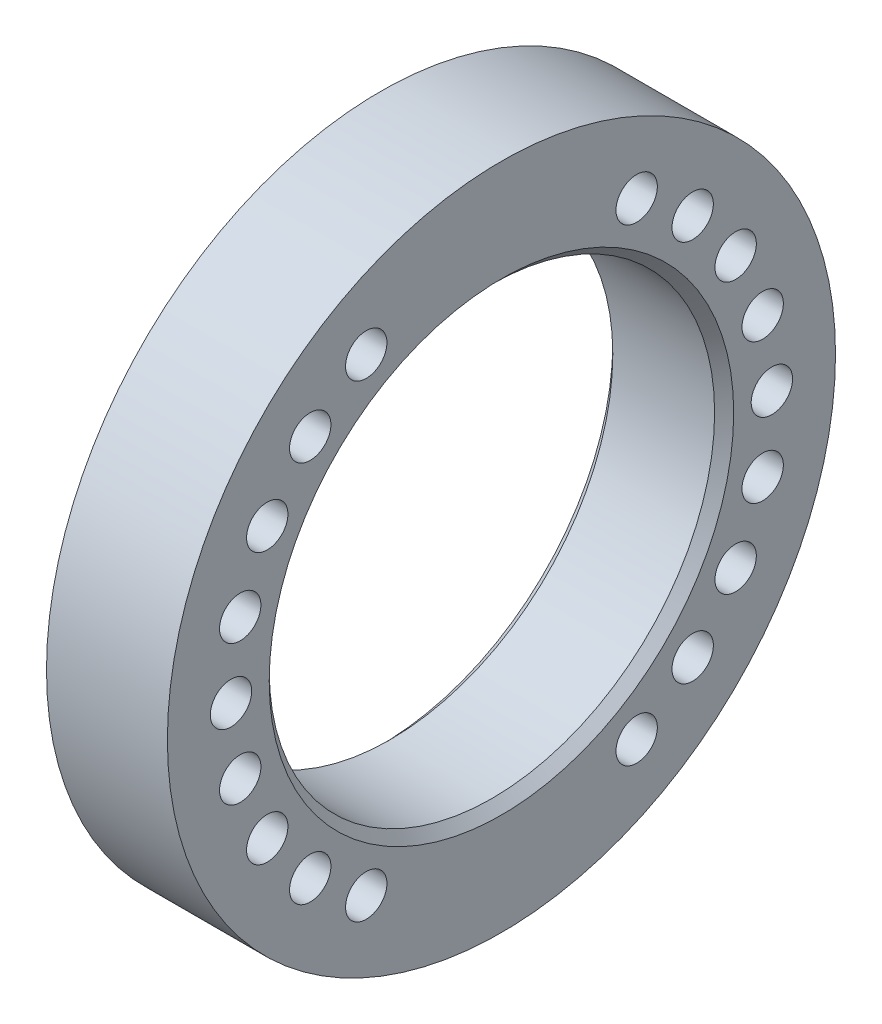
ISO-10303-21;
HEADER;
FILE_DESCRIPTION(('STEP AP214'),'2;1');
FILE_NAME('part.step','',(''),(''),'','','');
FILE_SCHEMA(('AUTOMOTIVE_DESIGN { 1 0 10303 214 1 1 1 1 }'));
ENDSEC;
DATA;
#1=APPLICATION_CONTEXT('core data for automotive mechanical design processes');
#2=APPLICATION_PROTOCOL_DEFINITION('international standard','automotive_design',2000,#1);
#3=PRODUCT_CONTEXT('',#1,'mechanical');
#4=PRODUCT('Part','Part','',(#3));
#5=PRODUCT_RELATED_PRODUCT_CATEGORY('part','',(#4));
#6=PRODUCT_DEFINITION_FORMATION('','',#4);
#7=PRODUCT_DEFINITION_CONTEXT('part definition',#1,'design');
#8=PRODUCT_DEFINITION('design','',#6,#7);
#9=PRODUCT_DEFINITION_SHAPE('','',#8);
#10=(LENGTH_UNIT() NAMED_UNIT(*) SI_UNIT(.MILLI.,.METRE.));
#11=(NAMED_UNIT(*) PLANE_ANGLE_UNIT() SI_UNIT($,.RADIAN.));
#12=(NAMED_UNIT(*) SI_UNIT($,.STERADIAN.) SOLID_ANGLE_UNIT());
#13=UNCERTAINTY_MEASURE_WITH_UNIT(LENGTH_MEASURE(1.E-05),#10,'distance_accuracy_value','');
#14=(GEOMETRIC_REPRESENTATION_CONTEXT(3) GLOBAL_UNCERTAINTY_ASSIGNED_CONTEXT((#13)) GLOBAL_UNIT_ASSIGNED_CONTEXT((#10,
#11,#12)) REPRESENTATION_CONTEXT('',''));
#15=CARTESIAN_POINT('',(0.,0.,0.));
#16=DIRECTION('',(0.,0.,1.));
#17=DIRECTION('',(1.,0.,0.));
#18=AXIS2_PLACEMENT_3D('',#15,#16,#17);
#19=CARTESIAN_POINT('',(19.,105.,0.));
#20=DIRECTION('',(1.,0.,0.));
#21=DIRECTION('',(0.,0.,-1.));
#22=AXIS2_PLACEMENT_3D('',#19,#20,#21);
#23=PLANE('',#22);
#24=CARTESIAN_POINT('',(19.,0.,0.));
#25=DIRECTION('',(1.,0.,0.));
#26=DIRECTION('',(0.,0.,-1.));
#27=AXIS2_PLACEMENT_3D('',#24,#25,#26);
#28=CIRCLE('',#27,73.);
#29=CARTESIAN_POINT('',(19.,0.,-73.));
#30=VERTEX_POINT('',#29);
#31=EDGE_CURVE('E10',#30,#30,#28,.F.);
#32=ORIENTED_EDGE('',*,*,#31,.T.);
#33=EDGE_LOOP('',(#32));
#34=FACE_BOUND('',#33,.T.);
#35=CARTESIAN_POINT('',(19.,-73.6121593216774,42.4999999999998));
#36=DIRECTION('',(-1.,0.,0.));
#37=DIRECTION('',(0.,-0.86602540378444,0.499999999999998));
#38=AXIS2_PLACEMENT_3D('',#35,#36,#37);
#39=CIRCLE('',#38,6.5);
#40=CARTESIAN_POINT('',(19.,-79.2413244462763,45.7499999999998));
#41=VERTEX_POINT('',#40);
#42=EDGE_CURVE('E117',#41,#41,#39,.T.);
#43=ORIENTED_EDGE('',*,*,#42,.T.);
#44=EDGE_LOOP('',(#43));
#45=FACE_BOUND('',#44,.T.);
#46=CARTESIAN_POINT('',(19.,-60.1040764008567,60.1040764008564));
#47=DIRECTION('',(-1.,0.,0.));
#48=DIRECTION('',(0.,-0.707106781186549,0.707106781186546));
#49=AXIS2_PLACEMENT_3D('',#46,#47,#48);
#50=CIRCLE('',#49,6.5);
#51=CARTESIAN_POINT('',(19.,-64.7002704785692,64.700270478569));
#52=VERTEX_POINT('',#51);
#53=EDGE_CURVE('E123',#52,#52,#50,.T.);
#54=ORIENTED_EDGE('',*,*,#53,.T.);
#55=EDGE_LOOP('',(#54));
#56=FACE_BOUND('',#55,.T.);
#57=CARTESIAN_POINT('',(19.,-42.5000000000001,73.6121593216773));
#58=DIRECTION('',(-1.,0.,0.));
#59=DIRECTION('',(0.,-0.500000000000001,0.866025403784438));
#60=AXIS2_PLACEMENT_3D('',#57,#58,#59);
#61=CIRCLE('',#60,6.5);
#62=CARTESIAN_POINT('',(19.,-45.7500000000001,79.2413244462761));
#63=VERTEX_POINT('',#62);
#64=EDGE_CURVE('E129',#63,#63,#61,.T.);
#65=ORIENTED_EDGE('',*,*,#64,.T.);
#66=EDGE_LOOP('',(#65));
#67=FACE_BOUND('',#66,.T.);
#68=CARTESIAN_POINT('',(19.,-21.9996188337143,82.1036952345708));
#69=DIRECTION('',(-1.,0.,0.));
#70=DIRECTION('',(0.,-0.258819045102521,0.965925826289068));
#71=AXIS2_PLACEMENT_3D('',#68,#69,#70);
#72=CIRCLE('',#71,6.5);
#73=CARTESIAN_POINT('',(19.,-23.6819426268807,88.3822131054498));
#74=VERTEX_POINT('',#73);
#75=EDGE_CURVE('E135',#74,#74,#72,.T.);
#76=ORIENTED_EDGE('',*,*,#75,.T.);
#77=EDGE_LOOP('',(#76));
#78=FACE_BOUND('',#77,.T.);
#79=CARTESIAN_POINT('',(19.,73.6121593216774,42.4999999999998));
#80=DIRECTION('',(-1.,0.,0.));
#81=DIRECTION('',(0.,0.86602540378444,0.499999999999998));
#82=AXIS2_PLACEMENT_3D('',#79,#80,#81);
#83=CIRCLE('',#82,6.5);
#84=CARTESIAN_POINT('',(19.,79.2413244462763,45.7499999999998));
#85=VERTEX_POINT('',#84);
#86=EDGE_CURVE('E141',#85,#85,#83,.T.);
#87=ORIENTED_EDGE('',*,*,#86,.T.);
#88=EDGE_LOOP('',(#87));
#89=FACE_BOUND('',#88,.T.);
#90=CARTESIAN_POINT('',(19.,60.1040764008567,60.1040764008564));
#91=DIRECTION('',(-1.,0.,0.));
#92=DIRECTION('',(0.,0.707106781186549,0.707106781186546));
#93=AXIS2_PLACEMENT_3D('',#90,#91,#92);
#94=CIRCLE('',#93,6.5);
#95=CARTESIAN_POINT('',(19.,64.7002704785692,64.700270478569));
#96=VERTEX_POINT('',#95);
#97=EDGE_CURVE('E147',#96,#96,#94,.T.);
#98=ORIENTED_EDGE('',*,*,#97,.T.);
#99=EDGE_LOOP('',(#98));
#100=FACE_BOUND('',#99,.T.);
#101=CARTESIAN_POINT('',(19.,42.5000000000001,73.6121593216773));
#102=DIRECTION('',(-1.,0.,0.));
#103=DIRECTION('',(0.,0.500000000000001,0.866025403784438));
#104=AXIS2_PLACEMENT_3D('',#101,#102,#103);
#105=CIRCLE('',#104,6.5);
#106=CARTESIAN_POINT('',(19.,45.7500000000001,79.2413244462761));
#107=VERTEX_POINT('',#106);
#108=EDGE_CURVE('E153',#107,#107,#105,.T.);
#109=ORIENTED_EDGE('',*,*,#108,.T.);
#110=EDGE_LOOP('',(#109));
#111=FACE_BOUND('',#110,.T.);
#112=CARTESIAN_POINT('',(19.,21.9996188337143,82.1036952345708));
#113=DIRECTION('',(-1.,0.,0.));
#114=DIRECTION('',(0.,0.258819045102521,0.965925826289068));
#115=AXIS2_PLACEMENT_3D('',#112,#113,#114);
#116=CIRCLE('',#115,6.5);
#117=CARTESIAN_POINT('',(19.,23.6819426268807,88.3822131054498));
#118=VERTEX_POINT('',#117);
#119=EDGE_CURVE('E159',#118,#118,#116,.T.);
#120=ORIENTED_EDGE('',*,*,#119,.T.);
#121=EDGE_LOOP('',(#120));
#122=FACE_BOUND('',#121,.T.);
#123=CARTESIAN_POINT('',(19.,0.,85.));
#124=DIRECTION('',(-1.,0.,0.));
#125=DIRECTION('',(0.,0.,1.));
#126=AXIS2_PLACEMENT_3D('',#123,#124,#125);
#127=CIRCLE('',#126,6.5);
#128=CARTESIAN_POINT('',(19.,0.,91.5));
#129=VERTEX_POINT('',#128);
#130=EDGE_CURVE('E111',#129,#129,#127,.T.);
#131=ORIENTED_EDGE('',*,*,#130,.T.);
#132=EDGE_LOOP('',(#131));
#133=FACE_BOUND('',#132,.T.);
#134=CARTESIAN_POINT('',(19.,-73.6121593216774,-42.4999999999998));
#135=DIRECTION('',(1.,0.,0.));
#136=DIRECTION('',(0.,-0.86602540378444,-0.499999999999998));
#137=AXIS2_PLACEMENT_3D('',#134,#135,#136);
#138=CIRCLE('',#137,6.5);
#139=CARTESIAN_POINT('',(19.,-79.2413244462763,-45.7499999999998));
#140=VERTEX_POINT('',#139);
#141=EDGE_CURVE('E69',#140,#140,#138,.T.);
#142=ORIENTED_EDGE('',*,*,#141,.F.);
#143=EDGE_LOOP('',(#142));
#144=FACE_BOUND('',#143,.T.);
#145=CARTESIAN_POINT('',(19.,-60.1040764008567,-60.1040764008564));
#146=DIRECTION('',(1.,0.,0.));
#147=DIRECTION('',(0.,-0.707106781186549,-0.707106781186546));
#148=AXIS2_PLACEMENT_3D('',#145,#146,#147);
#149=CIRCLE('',#148,6.5);
#150=CARTESIAN_POINT('',(19.,-64.7002704785692,-64.700270478569));
#151=VERTEX_POINT('',#150);
#152=EDGE_CURVE('E76',#151,#151,#149,.T.);
#153=ORIENTED_EDGE('',*,*,#152,.F.);
#154=EDGE_LOOP('',(#153));
#155=FACE_BOUND('',#154,.T.);
#156=CARTESIAN_POINT('',(19.,-42.5000000000001,-73.6121593216773));
#157=DIRECTION('',(1.,0.,0.));
#158=DIRECTION('',(0.,-0.500000000000001,-0.866025403784438));
#159=AXIS2_PLACEMENT_3D('',#156,#157,#158);
#160=CIRCLE('',#159,6.5);
#161=CARTESIAN_POINT('',(19.,-45.7500000000001,-79.2413244462761));
#162=VERTEX_POINT('',#161);
#163=EDGE_CURVE('E82',#162,#162,#160,.T.);
#164=ORIENTED_EDGE('',*,*,#163,.F.);
#165=EDGE_LOOP('',(#164));
#166=FACE_BOUND('',#165,.T.);
#167=CARTESIAN_POINT('',(19.,42.5000000000001,-73.6121593216773));
#168=DIRECTION('',(1.,0.,0.));
#169=DIRECTION('',(0.,0.500000000000001,-0.866025403784438));
#170=AXIS2_PLACEMENT_3D('',#167,#168,#169);
#171=CIRCLE('',#170,6.5);
#172=CARTESIAN_POINT('',(19.,45.7500000000001,-79.2413244462761));
#173=VERTEX_POINT('',#172);
#174=EDGE_CURVE('E96',#173,#173,#171,.T.);
#175=ORIENTED_EDGE('',*,*,#174,.F.);
#176=EDGE_LOOP('',(#175));
#177=FACE_BOUND('',#176,.T.);
#178=CARTESIAN_POINT('',(19.,60.1040764008567,-60.1040764008564));
#179=DIRECTION('',(1.,0.,0.));
#180=DIRECTION('',(0.,0.707106781186549,-0.707106781186546));
#181=AXIS2_PLACEMENT_3D('',#178,#179,#180);
#182=CIRCLE('',#181,6.5);
#183=CARTESIAN_POINT('',(19.,64.7002704785692,-64.700270478569));
#184=VERTEX_POINT('',#183);
#185=EDGE_CURVE('E89',#184,#184,#182,.T.);
#186=ORIENTED_EDGE('',*,*,#185,.F.);
#187=EDGE_LOOP('',(#186));
#188=FACE_BOUND('',#187,.T.);
#189=CARTESIAN_POINT('',(19.,73.6121593216774,-42.4999999999998));
#190=DIRECTION('',(1.,0.,0.));
#191=DIRECTION('',(0.,0.86602540378444,-0.499999999999998));
#192=AXIS2_PLACEMENT_3D('',#189,#190,#191);
#193=CIRCLE('',#192,6.5);
#194=CARTESIAN_POINT('',(19.,79.2413244462763,-45.7499999999998));
#195=VERTEX_POINT('',#194);
#196=EDGE_CURVE('E106',#195,#195,#193,.T.);
#197=ORIENTED_EDGE('',*,*,#196,.F.);
#198=EDGE_LOOP('',(#197));
#199=FACE_BOUND('',#198,.T.);
#200=CARTESIAN_POINT('',(19.,-21.9996188337143,-82.1036952345708));
#201=DIRECTION('',(1.,0.,0.));
#202=DIRECTION('',(0.,-0.258819045102521,-0.965925826289068));
#203=AXIS2_PLACEMENT_3D('',#200,#201,#202);
#204=CIRCLE('',#203,6.5);
#205=CARTESIAN_POINT('',(19.,-23.6819426268807,-88.3822131054498));
#206=VERTEX_POINT('',#205);
#207=EDGE_CURVE('E88',#206,#206,#204,.T.);
#208=ORIENTED_EDGE('',*,*,#207,.F.);
#209=EDGE_LOOP('',(#208));
#210=FACE_BOUND('',#209,.T.);
#211=CARTESIAN_POINT('',(19.,21.9996188337143,-82.1036952345708));
#212=DIRECTION('',(1.,0.,0.));
#213=DIRECTION('',(0.,0.258819045102521,-0.965925826289068));
#214=AXIS2_PLACEMENT_3D('',#211,#212,#213);
#215=CIRCLE('',#214,6.5);
#216=CARTESIAN_POINT('',(19.,23.6819426268807,-88.3822131054498));
#217=VERTEX_POINT('',#216);
#218=EDGE_CURVE('E63',#217,#217,#215,.T.);
#219=ORIENTED_EDGE('',*,*,#218,.F.);
#220=EDGE_LOOP('',(#219));
#221=FACE_BOUND('',#220,.T.);
#222=CARTESIAN_POINT('',(19.,0.,-85.));
#223=DIRECTION('',(1.,0.,0.));
#224=DIRECTION('',(0.,0.,-1.));
#225=AXIS2_PLACEMENT_3D('',#222,#223,#224);
#226=CIRCLE('',#225,6.5);
#227=CARTESIAN_POINT('',(19.,0.,-91.5));
#228=VERTEX_POINT('',#227);
#229=EDGE_CURVE('E57',#228,#228,#226,.T.);
#230=ORIENTED_EDGE('',*,*,#229,.F.);
#231=EDGE_LOOP('',(#230));
#232=FACE_BOUND('',#231,.T.);
#233=CARTESIAN_POINT('',(19.,0.,0.));
#234=DIRECTION('',(1.,0.,0.));
#235=DIRECTION('',(0.,0.,-1.));
#236=AXIS2_PLACEMENT_3D('',#233,#234,#235);
#237=CIRCLE('',#236,105.);
#238=CARTESIAN_POINT('',(19.,0.,-105.));
#239=VERTEX_POINT('',#238);
#240=EDGE_CURVE('E50',#239,#239,#237,.T.);
#241=ORIENTED_EDGE('',*,*,#240,.T.);
#242=EDGE_LOOP('',(#241));
#243=FACE_BOUND('',#242,.T.);
#244=ADVANCED_FACE('F30',(#34,#45,#56,#67,#78,#89,#100,#111,#122,#133,#144,#155,#166,#177,#188,
#199,#210,#221,#232,#243),#23,.T.);
#245=CARTESIAN_POINT('',(0.,0.,0.));
#246=DIRECTION('',(1.,0.,0.));
#247=DIRECTION('',(0.,0.,-1.));
#248=AXIS2_PLACEMENT_3D('',#245,#246,#247);
#249=CYLINDRICAL_SURFACE('',#248,105.);
#250=CARTESIAN_POINT('',(-19.,0.,0.));
#251=DIRECTION('',(1.,0.,0.));
#252=DIRECTION('',(0.,0.,-1.));
#253=AXIS2_PLACEMENT_3D('',#250,#251,#252);
#254=CIRCLE('',#253,105.);
#255=CARTESIAN_POINT('',(-19.,0.,-105.));
#256=VERTEX_POINT('',#255);
#257=EDGE_CURVE('E53',#256,#256,#254,.T.);
#258=ORIENTED_EDGE('',*,*,#257,.T.);
#259=EDGE_LOOP('',(#258));
#260=FACE_BOUND('',#259,.T.);
#261=ORIENTED_EDGE('',*,*,#240,.F.);
#262=EDGE_LOOP('',(#261));
#263=FACE_BOUND('',#262,.T.);
#264=ADVANCED_FACE('F172',(#260,#263),#249,.T.);
#265=CARTESIAN_POINT('',(-19.,105.,0.));
#266=DIRECTION('',(-1.,0.,0.));
#267=DIRECTION('',(0.,0.,1.));
#268=AXIS2_PLACEMENT_3D('',#265,#266,#267);
#269=PLANE('',#268);
#270=CARTESIAN_POINT('',(-19.,0.,0.));
#271=DIRECTION('',(-1.,0.,0.));
#272=DIRECTION('',(0.,0.,1.));
#273=AXIS2_PLACEMENT_3D('',#270,#271,#272);
#274=CIRCLE('',#273,73.);
#275=CARTESIAN_POINT('',(-19.,0.,73.));
#276=VERTEX_POINT('',#275);
#277=EDGE_CURVE('E45',#276,#276,#274,.F.);
#278=ORIENTED_EDGE('',*,*,#277,.T.);
#279=EDGE_LOOP('',(#278));
#280=FACE_BOUND('',#279,.T.);
#281=CARTESIAN_POINT('',(-19.,-73.6121593216774,42.4999999999998));
#282=DIRECTION('',(-1.,0.,0.));
#283=DIRECTION('',(0.,-0.86602540378444,0.499999999999998));
#284=AXIS2_PLACEMENT_3D('',#281,#282,#283);
#285=CIRCLE('',#284,6.5);
#286=CARTESIAN_POINT('',(-19.,-79.2413244462763,45.7499999999998));
#287=VERTEX_POINT('',#286);
#288=EDGE_CURVE('E120',#287,#287,#285,.T.);
#289=ORIENTED_EDGE('',*,*,#288,.F.);
#290=EDGE_LOOP('',(#289));
#291=FACE_BOUND('',#290,.T.);
#292=CARTESIAN_POINT('',(-19.,-60.1040764008567,60.1040764008564));
#293=DIRECTION('',(-1.,0.,0.));
#294=DIRECTION('',(0.,-0.707106781186549,0.707106781186546));
#295=AXIS2_PLACEMENT_3D('',#292,#293,#294);
#296=CIRCLE('',#295,6.5);
#297=CARTESIAN_POINT('',(-19.,-64.7002704785692,64.700270478569));
#298=VERTEX_POINT('',#297);
#299=EDGE_CURVE('E126',#298,#298,#296,.T.);
#300=ORIENTED_EDGE('',*,*,#299,.F.);
#301=EDGE_LOOP('',(#300));
#302=FACE_BOUND('',#301,.T.);
#303=CARTESIAN_POINT('',(-19.,-42.5000000000001,73.6121593216773));
#304=DIRECTION('',(-1.,0.,0.));
#305=DIRECTION('',(0.,-0.500000000000001,0.866025403784438));
#306=AXIS2_PLACEMENT_3D('',#303,#304,#305);
#307=CIRCLE('',#306,6.5);
#308=CARTESIAN_POINT('',(-19.,-45.7500000000001,79.2413244462761));
#309=VERTEX_POINT('',#308);
#310=EDGE_CURVE('E132',#309,#309,#307,.T.);
#311=ORIENTED_EDGE('',*,*,#310,.F.);
#312=EDGE_LOOP('',(#311));
#313=FACE_BOUND('',#312,.T.);
#314=CARTESIAN_POINT('',(-19.,-21.9996188337143,82.1036952345708));
#315=DIRECTION('',(-1.,0.,0.));
#316=DIRECTION('',(0.,-0.258819045102521,0.965925826289068));
#317=AXIS2_PLACEMENT_3D('',#314,#315,#316);
#318=CIRCLE('',#317,6.5);
#319=CARTESIAN_POINT('',(-19.,-23.6819426268807,88.3822131054498));
#320=VERTEX_POINT('',#319);
#321=EDGE_CURVE('E138',#320,#320,#318,.T.);
#322=ORIENTED_EDGE('',*,*,#321,.F.);
#323=EDGE_LOOP('',(#322));
#324=FACE_BOUND('',#323,.T.);
#325=CARTESIAN_POINT('',(-19.,73.6121593216774,42.4999999999998));
#326=DIRECTION('',(-1.,0.,0.));
#327=DIRECTION('',(0.,0.86602540378444,0.499999999999998));
#328=AXIS2_PLACEMENT_3D('',#325,#326,#327);
#329=CIRCLE('',#328,6.5);
#330=CARTESIAN_POINT('',(-19.,79.2413244462763,45.7499999999998));
#331=VERTEX_POINT('',#330);
#332=EDGE_CURVE('E144',#331,#331,#329,.T.);
#333=ORIENTED_EDGE('',*,*,#332,.F.);
#334=EDGE_LOOP('',(#333));
#335=FACE_BOUND('',#334,.T.);
#336=CARTESIAN_POINT('',(-19.,60.1040764008567,60.1040764008564));
#337=DIRECTION('',(-1.,0.,0.));
#338=DIRECTION('',(0.,0.707106781186549,0.707106781186546));
#339=AXIS2_PLACEMENT_3D('',#336,#337,#338);
#340=CIRCLE('',#339,6.5);
#341=CARTESIAN_POINT('',(-19.,64.7002704785692,64.700270478569));
#342=VERTEX_POINT('',#341);
#343=EDGE_CURVE('E150',#342,#342,#340,.T.);
#344=ORIENTED_EDGE('',*,*,#343,.F.);
#345=EDGE_LOOP('',(#344));
#346=FACE_BOUND('',#345,.T.);
#347=CARTESIAN_POINT('',(-19.,42.5000000000001,73.6121593216773));
#348=DIRECTION('',(-1.,0.,0.));
#349=DIRECTION('',(0.,0.500000000000001,0.866025403784438));
#350=AXIS2_PLACEMENT_3D('',#347,#348,#349);
#351=CIRCLE('',#350,6.5);
#352=CARTESIAN_POINT('',(-19.,45.7500000000001,79.2413244462761));
#353=VERTEX_POINT('',#352);
#354=EDGE_CURVE('E156',#353,#353,#351,.T.);
#355=ORIENTED_EDGE('',*,*,#354,.F.);
#356=EDGE_LOOP('',(#355));
#357=FACE_BOUND('',#356,.T.);
#358=CARTESIAN_POINT('',(-19.,21.9996188337143,82.1036952345708));
#359=DIRECTION('',(-1.,0.,0.));
#360=DIRECTION('',(0.,0.258819045102521,0.965925826289068));
#361=AXIS2_PLACEMENT_3D('',#358,#359,#360);
#362=CIRCLE('',#361,6.5);
#363=CARTESIAN_POINT('',(-19.,23.6819426268807,88.3822131054498));
#364=VERTEX_POINT('',#363);
#365=EDGE_CURVE('E114',#364,#364,#362,.T.);
#366=ORIENTED_EDGE('',*,*,#365,.F.);
#367=EDGE_LOOP('',(#366));
#368=FACE_BOUND('',#367,.T.);
#369=CARTESIAN_POINT('',(-19.,0.,85.));
#370=DIRECTION('',(-1.,0.,0.));
#371=DIRECTION('',(0.,0.,1.));
#372=AXIS2_PLACEMENT_3D('',#369,#370,#371);
#373=CIRCLE('',#372,6.5);
#374=CARTESIAN_POINT('',(-19.,0.,91.5));
#375=VERTEX_POINT('',#374);
#376=EDGE_CURVE('E73',#375,#375,#373,.T.);
#377=ORIENTED_EDGE('',*,*,#376,.F.);
#378=EDGE_LOOP('',(#377));
#379=FACE_BOUND('',#378,.T.);
#380=CARTESIAN_POINT('',(-19.,-73.6121593216774,-42.4999999999998));
#381=DIRECTION('',(1.,0.,0.));
#382=DIRECTION('',(0.,-0.86602540378444,-0.499999999999998));
#383=AXIS2_PLACEMENT_3D('',#380,#381,#382);
#384=CIRCLE('',#383,6.5);
#385=CARTESIAN_POINT('',(-19.,-79.2413244462763,-45.7499999999998));
#386=VERTEX_POINT('',#385);
#387=EDGE_CURVE('E72',#386,#386,#384,.T.);
#388=ORIENTED_EDGE('',*,*,#387,.T.);
#389=EDGE_LOOP('',(#388));
#390=FACE_BOUND('',#389,.T.);
#391=CARTESIAN_POINT('',(-19.,-60.1040764008567,-60.1040764008564));
#392=DIRECTION('',(1.,0.,0.));
#393=DIRECTION('',(0.,-0.707106781186549,-0.707106781186546));
#394=AXIS2_PLACEMENT_3D('',#391,#392,#393);
#395=CIRCLE('',#394,6.5);
#396=CARTESIAN_POINT('',(-19.,-64.7002704785692,-64.700270478569));
#397=VERTEX_POINT('',#396);
#398=EDGE_CURVE('E79',#397,#397,#395,.T.);
#399=ORIENTED_EDGE('',*,*,#398,.T.);
#400=EDGE_LOOP('',(#399));
#401=FACE_BOUND('',#400,.T.);
#402=CARTESIAN_POINT('',(-19.,-42.5000000000001,-73.6121593216773));
#403=DIRECTION('',(1.,0.,0.));
#404=DIRECTION('',(0.,-0.500000000000001,-0.866025403784438));
#405=AXIS2_PLACEMENT_3D('',#402,#403,#404);
#406=CIRCLE('',#405,6.5);
#407=CARTESIAN_POINT('',(-19.,-45.7500000000001,-79.2413244462761));
#408=VERTEX_POINT('',#407);
#409=EDGE_CURVE('E85',#408,#408,#406,.T.);
#410=ORIENTED_EDGE('',*,*,#409,.T.);
#411=EDGE_LOOP('',(#410));
#412=FACE_BOUND('',#411,.T.);
#413=CARTESIAN_POINT('',(-19.,42.5000000000001,-73.6121593216773));
#414=DIRECTION('',(1.,0.,0.));
#415=DIRECTION('',(0.,0.500000000000001,-0.866025403784438));
#416=AXIS2_PLACEMENT_3D('',#413,#414,#415);
#417=CIRCLE('',#416,6.5);
#418=CARTESIAN_POINT('',(-19.,45.7500000000001,-79.2413244462761));
#419=VERTEX_POINT('',#418);
#420=EDGE_CURVE('E66',#419,#419,#417,.T.);
#421=ORIENTED_EDGE('',*,*,#420,.T.);
#422=EDGE_LOOP('',(#421));
#423=FACE_BOUND('',#422,.T.);
#424=CARTESIAN_POINT('',(-19.,60.1040764008567,-60.1040764008564));
#425=DIRECTION('',(1.,0.,0.));
#426=DIRECTION('',(0.,0.707106781186549,-0.707106781186546));
#427=AXIS2_PLACEMENT_3D('',#424,#425,#426);
#428=CIRCLE('',#427,6.5);
#429=CARTESIAN_POINT('',(-19.,64.7002704785692,-64.700270478569));
#430=VERTEX_POINT('',#429);
#431=EDGE_CURVE('E92',#430,#430,#428,.T.);
#432=ORIENTED_EDGE('',*,*,#431,.T.);
#433=EDGE_LOOP('',(#432));
#434=FACE_BOUND('',#433,.T.);
#435=CARTESIAN_POINT('',(-19.,73.6121593216774,-42.4999999999998));
#436=DIRECTION('',(1.,0.,0.));
#437=DIRECTION('',(0.,0.86602540378444,-0.499999999999998));
#438=AXIS2_PLACEMENT_3D('',#435,#436,#437);
#439=CIRCLE('',#438,6.5);
#440=CARTESIAN_POINT('',(-19.,79.2413244462763,-45.7499999999998));
#441=VERTEX_POINT('',#440);
#442=EDGE_CURVE('E93',#441,#441,#439,.T.);
#443=ORIENTED_EDGE('',*,*,#442,.T.);
#444=EDGE_LOOP('',(#443));
#445=FACE_BOUND('',#444,.T.);
#446=CARTESIAN_POINT('',(-19.,-21.9996188337143,-82.1036952345708));
#447=DIRECTION('',(1.,0.,0.));
#448=DIRECTION('',(0.,-0.258819045102521,-0.965925826289068));
#449=AXIS2_PLACEMENT_3D('',#446,#447,#448);
#450=CIRCLE('',#449,6.5);
#451=CARTESIAN_POINT('',(-19.,-23.6819426268807,-88.3822131054498));
#452=VERTEX_POINT('',#451);
#453=EDGE_CURVE('E103',#452,#452,#450,.T.);
#454=ORIENTED_EDGE('',*,*,#453,.T.);
#455=EDGE_LOOP('',(#454));
#456=FACE_BOUND('',#455,.T.);
#457=CARTESIAN_POINT('',(-19.,21.9996188337143,-82.1036952345708));
#458=DIRECTION('',(1.,0.,0.));
#459=DIRECTION('',(0.,0.258819045102521,-0.965925826289068));
#460=AXIS2_PLACEMENT_3D('',#457,#458,#459);
#461=CIRCLE('',#460,6.5);
#462=CARTESIAN_POINT('',(-19.,23.6819426268807,-88.3822131054498));
#463=VERTEX_POINT('',#462);
#464=EDGE_CURVE('E60',#463,#463,#461,.T.);
#465=ORIENTED_EDGE('',*,*,#464,.T.);
#466=EDGE_LOOP('',(#465));
#467=FACE_BOUND('',#466,.T.);
#468=CARTESIAN_POINT('',(-19.,0.,-85.));
#469=DIRECTION('',(1.,0.,0.));
#470=DIRECTION('',(0.,0.,-1.));
#471=AXIS2_PLACEMENT_3D('',#468,#469,#470);
#472=CIRCLE('',#471,6.5);
#473=CARTESIAN_POINT('',(-19.,0.,-91.5));
#474=VERTEX_POINT('',#473);
#475=EDGE_CURVE('E56',#474,#474,#472,.T.);
#476=ORIENTED_EDGE('',*,*,#475,.T.);
#477=EDGE_LOOP('',(#476));
#478=FACE_BOUND('',#477,.T.);
#479=ORIENTED_EDGE('',*,*,#257,.F.);
#480=EDGE_LOOP('',(#479));
#481=FACE_BOUND('',#480,.T.);
#482=ADVANCED_FACE('F168',(#280,#291,#302,#313,#324,#335,#346,#357,#368,#379,#390,#401,#412,
#423,#434,#445,#456,#467,#478,#481),#269,.T.);
#483=CARTESIAN_POINT('',(0.,0.,0.));
#484=DIRECTION('',(1.,0.,0.));
#485=DIRECTION('',(0.,0.,-1.));
#486=AXIS2_PLACEMENT_3D('',#483,#484,#485);
#487=CYLINDRICAL_SURFACE('',#486,70.);
#488=CARTESIAN_POINT('',(-16.,0.,0.));
#489=DIRECTION('',(-1.,0.,0.));
#490=DIRECTION('',(0.,0.,1.));
#491=AXIS2_PLACEMENT_3D('',#488,#489,#490);
#492=CIRCLE('',#491,70.);
#493=CARTESIAN_POINT('',(-16.,0.,70.));
#494=VERTEX_POINT('',#493);
#495=EDGE_CURVE('E37',#494,#494,#492,.T.);
#496=ORIENTED_EDGE('',*,*,#495,.T.);
#497=EDGE_LOOP('',(#496));
#498=FACE_BOUND('',#497,.T.);
#499=CARTESIAN_POINT('',(16.,0.,0.));
#500=DIRECTION('',(1.,0.,0.));
#501=DIRECTION('',(0.,0.,-1.));
#502=AXIS2_PLACEMENT_3D('',#499,#500,#501);
#503=CIRCLE('',#502,70.);
#504=CARTESIAN_POINT('',(16.,0.,-70.));
#505=VERTEX_POINT('',#504);
#506=EDGE_CURVE('E41',#505,#505,#503,.T.);
#507=ORIENTED_EDGE('',*,*,#506,.T.);
#508=EDGE_LOOP('',(#507));
#509=FACE_BOUND('',#508,.T.);
#510=ADVANCED_FACE('F171',(#498,#509),#487,.F.);
#511=CARTESIAN_POINT('',(-19.,0.,-85.));
#512=DIRECTION('',(1.,0.,0.));
#513=DIRECTION('',(0.,0.,-1.));
#514=AXIS2_PLACEMENT_3D('',#511,#512,#513);
#515=CYLINDRICAL_SURFACE('',#514,6.5);
#516=ORIENTED_EDGE('',*,*,#475,.F.);
#517=EDGE_LOOP('',(#516));
#518=FACE_BOUND('',#517,.T.);
#519=ORIENTED_EDGE('',*,*,#229,.T.);
#520=EDGE_LOOP('',(#519));
#521=FACE_BOUND('',#520,.T.);
#522=ADVANCED_FACE('F266',(#518,#521),#515,.F.);
#523=CARTESIAN_POINT('',(-19.,21.9996188337143,-82.1036952345708));
#524=DIRECTION('',(1.,0.,0.));
#525=DIRECTION('',(0.,0.,-1.));
#526=AXIS2_PLACEMENT_3D('',#523,#524,#525);
#527=CYLINDRICAL_SURFACE('',#526,6.5);
#528=ORIENTED_EDGE('',*,*,#464,.F.);
#529=EDGE_LOOP('',(#528));
#530=FACE_BOUND('',#529,.T.);
#531=ORIENTED_EDGE('',*,*,#218,.T.);
#532=EDGE_LOOP('',(#531));
#533=FACE_BOUND('',#532,.T.);
#534=ADVANCED_FACE('F268',(#530,#533),#527,.F.);
#535=CARTESIAN_POINT('',(-19.,-21.9996188337143,-82.1036952345708));
#536=DIRECTION('',(1.,0.,0.));
#537=DIRECTION('',(0.,0.,-1.));
#538=AXIS2_PLACEMENT_3D('',#535,#536,#537);
#539=CYLINDRICAL_SURFACE('',#538,6.5);
#540=ORIENTED_EDGE('',*,*,#453,.F.);
#541=EDGE_LOOP('',(#540));
#542=FACE_BOUND('',#541,.T.);
#543=ORIENTED_EDGE('',*,*,#207,.T.);
#544=EDGE_LOOP('',(#543));
#545=FACE_BOUND('',#544,.T.);
#546=ADVANCED_FACE('F275',(#542,#545),#539,.F.);
#547=CARTESIAN_POINT('',(-19.,73.6121593216774,-42.4999999999998));
#548=DIRECTION('',(1.,0.,0.));
#549=DIRECTION('',(0.,0.,-1.));
#550=AXIS2_PLACEMENT_3D('',#547,#548,#549);
#551=CYLINDRICAL_SURFACE('',#550,6.5);
#552=ORIENTED_EDGE('',*,*,#442,.F.);
#553=EDGE_LOOP('',(#552));
#554=FACE_BOUND('',#553,.T.);
#555=ORIENTED_EDGE('',*,*,#196,.T.);
#556=EDGE_LOOP('',(#555));
#557=FACE_BOUND('',#556,.T.);
#558=ADVANCED_FACE('F297',(#554,#557),#551,.F.);
#559=CARTESIAN_POINT('',(-19.,60.1040764008567,-60.1040764008564));
#560=DIRECTION('',(1.,0.,0.));
#561=DIRECTION('',(0.,0.,-1.));
#562=AXIS2_PLACEMENT_3D('',#559,#560,#561);
#563=CYLINDRICAL_SURFACE('',#562,6.5);
#564=ORIENTED_EDGE('',*,*,#431,.F.);
#565=EDGE_LOOP('',(#564));
#566=FACE_BOUND('',#565,.T.);
#567=ORIENTED_EDGE('',*,*,#185,.T.);
#568=EDGE_LOOP('',(#567));
#569=FACE_BOUND('',#568,.T.);
#570=ADVANCED_FACE('F294',(#566,#569),#563,.F.);
#571=CARTESIAN_POINT('',(-19.,42.5000000000001,-73.6121593216773));
#572=DIRECTION('',(1.,0.,0.));
#573=DIRECTION('',(0.,0.,-1.));
#574=AXIS2_PLACEMENT_3D('',#571,#572,#573);
#575=CYLINDRICAL_SURFACE('',#574,6.5);
#576=ORIENTED_EDGE('',*,*,#420,.F.);
#577=EDGE_LOOP('',(#576));
#578=FACE_BOUND('',#577,.T.);
#579=ORIENTED_EDGE('',*,*,#174,.T.);
#580=EDGE_LOOP('',(#579));
#581=FACE_BOUND('',#580,.T.);
#582=ADVANCED_FACE('F292',(#578,#581),#575,.F.);
#583=CARTESIAN_POINT('',(-19.,-42.5000000000001,-73.6121593216773));
#584=DIRECTION('',(1.,0.,0.));
#585=DIRECTION('',(0.,0.,-1.));
#586=AXIS2_PLACEMENT_3D('',#583,#584,#585);
#587=CYLINDRICAL_SURFACE('',#586,6.5);
#588=ORIENTED_EDGE('',*,*,#409,.F.);
#589=EDGE_LOOP('',(#588));
#590=FACE_BOUND('',#589,.T.);
#591=ORIENTED_EDGE('',*,*,#163,.T.);
#592=EDGE_LOOP('',(#591));
#593=FACE_BOUND('',#592,.T.);
#594=ADVANCED_FACE('F288',(#590,#593),#587,.F.);
#595=CARTESIAN_POINT('',(-19.,-60.1040764008567,-60.1040764008564));
#596=DIRECTION('',(1.,0.,0.));
#597=DIRECTION('',(0.,0.,-1.));
#598=AXIS2_PLACEMENT_3D('',#595,#596,#597);
#599=CYLINDRICAL_SURFACE('',#598,6.5);
#600=ORIENTED_EDGE('',*,*,#398,.F.);
#601=EDGE_LOOP('',(#600));
#602=FACE_BOUND('',#601,.T.);
#603=ORIENTED_EDGE('',*,*,#152,.T.);
#604=EDGE_LOOP('',(#603));
#605=FACE_BOUND('',#604,.T.);
#606=ADVANCED_FACE('F284',(#602,#605),#599,.F.);
#607=CARTESIAN_POINT('',(-19.,-73.6121593216774,-42.4999999999998));
#608=DIRECTION('',(1.,0.,0.));
#609=DIRECTION('',(0.,0.,-1.));
#610=AXIS2_PLACEMENT_3D('',#607,#608,#609);
#611=CYLINDRICAL_SURFACE('',#610,6.5);
#612=ORIENTED_EDGE('',*,*,#387,.F.);
#613=EDGE_LOOP('',(#612));
#614=FACE_BOUND('',#613,.T.);
#615=ORIENTED_EDGE('',*,*,#141,.T.);
#616=EDGE_LOOP('',(#615));
#617=FACE_BOUND('',#616,.T.);
#618=ADVANCED_FACE('F280',(#614,#617),#611,.F.);
#619=CARTESIAN_POINT('',(-19.,0.,85.));
#620=DIRECTION('',(1.,0.,0.));
#621=DIRECTION('',(0.,0.,-1.));
#622=AXIS2_PLACEMENT_3D('',#619,#620,#621);
#623=CYLINDRICAL_SURFACE('',#622,6.5);
#624=ORIENTED_EDGE('',*,*,#376,.T.);
#625=EDGE_LOOP('',(#624));
#626=FACE_BOUND('',#625,.T.);
#627=ORIENTED_EDGE('',*,*,#130,.F.);
#628=EDGE_LOOP('',(#627));
#629=FACE_BOUND('',#628,.T.);
#630=ADVANCED_FACE('F283',(#626,#629),#623,.F.);
#631=CARTESIAN_POINT('',(-19.,21.9996188337143,82.1036952345708));
#632=DIRECTION('',(1.,0.,0.));
#633=DIRECTION('',(0.,0.,-1.));
#634=AXIS2_PLACEMENT_3D('',#631,#632,#633);
#635=CYLINDRICAL_SURFACE('',#634,6.5);
#636=ORIENTED_EDGE('',*,*,#365,.T.);
#637=EDGE_LOOP('',(#636));
#638=FACE_BOUND('',#637,.T.);
#639=ORIENTED_EDGE('',*,*,#119,.F.);
#640=EDGE_LOOP('',(#639));
#641=FACE_BOUND('',#640,.T.);
#642=ADVANCED_FACE('F165',(#638,#641),#635,.F.);
#643=CARTESIAN_POINT('',(-19.,42.5000000000001,73.6121593216773));
#644=DIRECTION('',(1.,0.,0.));
#645=DIRECTION('',(0.,0.,-1.));
#646=AXIS2_PLACEMENT_3D('',#643,#644,#645);
#647=CYLINDRICAL_SURFACE('',#646,6.5);
#648=ORIENTED_EDGE('',*,*,#354,.T.);
#649=EDGE_LOOP('',(#648));
#650=FACE_BOUND('',#649,.T.);
#651=ORIENTED_EDGE('',*,*,#108,.F.);
#652=EDGE_LOOP('',(#651));
#653=FACE_BOUND('',#652,.T.);
#654=ADVANCED_FACE('F236',(#650,#653),#647,.F.);
#655=CARTESIAN_POINT('',(-19.,60.1040764008567,60.1040764008564));
#656=DIRECTION('',(1.,0.,0.));
#657=DIRECTION('',(0.,0.,-1.));
#658=AXIS2_PLACEMENT_3D('',#655,#656,#657);
#659=CYLINDRICAL_SURFACE('',#658,6.5);
#660=ORIENTED_EDGE('',*,*,#343,.T.);
#661=EDGE_LOOP('',(#660));
#662=FACE_BOUND('',#661,.T.);
#663=ORIENTED_EDGE('',*,*,#97,.F.);
#664=EDGE_LOOP('',(#663));
#665=FACE_BOUND('',#664,.T.);
#666=ADVANCED_FACE('F239',(#662,#665),#659,.F.);
#667=CARTESIAN_POINT('',(-19.,73.6121593216774,42.4999999999998));
#668=DIRECTION('',(1.,0.,0.));
#669=DIRECTION('',(0.,0.,-1.));
#670=AXIS2_PLACEMENT_3D('',#667,#668,#669);
#671=CYLINDRICAL_SURFACE('',#670,6.5);
#672=ORIENTED_EDGE('',*,*,#332,.T.);
#673=EDGE_LOOP('',(#672));
#674=FACE_BOUND('',#673,.T.);
#675=ORIENTED_EDGE('',*,*,#86,.F.);
#676=EDGE_LOOP('',(#675));
#677=FACE_BOUND('',#676,.T.);
#678=ADVANCED_FACE('F321',(#674,#677),#671,.F.);
#679=CARTESIAN_POINT('',(-19.,-21.9996188337143,82.1036952345708));
#680=DIRECTION('',(1.,0.,0.));
#681=DIRECTION('',(0.,0.,-1.));
#682=AXIS2_PLACEMENT_3D('',#679,#680,#681);
#683=CYLINDRICAL_SURFACE('',#682,6.5);
#684=ORIENTED_EDGE('',*,*,#321,.T.);
#685=EDGE_LOOP('',(#684));
#686=FACE_BOUND('',#685,.T.);
#687=ORIENTED_EDGE('',*,*,#75,.F.);
#688=EDGE_LOOP('',(#687));
#689=FACE_BOUND('',#688,.T.);
#690=ADVANCED_FACE('F317',(#686,#689),#683,.F.);
#691=CARTESIAN_POINT('',(-19.,-42.5000000000001,73.6121593216773));
#692=DIRECTION('',(1.,0.,0.));
#693=DIRECTION('',(0.,0.,-1.));
#694=AXIS2_PLACEMENT_3D('',#691,#692,#693);
#695=CYLINDRICAL_SURFACE('',#694,6.5);
#696=ORIENTED_EDGE('',*,*,#310,.T.);
#697=EDGE_LOOP('',(#696));
#698=FACE_BOUND('',#697,.T.);
#699=ORIENTED_EDGE('',*,*,#64,.F.);
#700=EDGE_LOOP('',(#699));
#701=FACE_BOUND('',#700,.T.);
#702=ADVANCED_FACE('F313',(#698,#701),#695,.F.);
#703=CARTESIAN_POINT('',(-19.,-60.1040764008567,60.1040764008564));
#704=DIRECTION('',(1.,0.,0.));
#705=DIRECTION('',(0.,0.,-1.));
#706=AXIS2_PLACEMENT_3D('',#703,#704,#705);
#707=CYLINDRICAL_SURFACE('',#706,6.5);
#708=ORIENTED_EDGE('',*,*,#299,.T.);
#709=EDGE_LOOP('',(#708));
#710=FACE_BOUND('',#709,.T.);
#711=ORIENTED_EDGE('',*,*,#53,.F.);
#712=EDGE_LOOP('',(#711));
#713=FACE_BOUND('',#712,.T.);
#714=ADVANCED_FACE('F216',(#710,#713),#707,.F.);
#715=CARTESIAN_POINT('',(-19.,-73.6121593216774,42.4999999999998));
#716=DIRECTION('',(1.,0.,0.));
#717=DIRECTION('',(0.,0.,-1.));
#718=AXIS2_PLACEMENT_3D('',#715,#716,#717);
#719=CYLINDRICAL_SURFACE('',#718,6.5);
#720=ORIENTED_EDGE('',*,*,#288,.T.);
#721=EDGE_LOOP('',(#720));
#722=FACE_BOUND('',#721,.T.);
#723=ORIENTED_EDGE('',*,*,#42,.F.);
#724=EDGE_LOOP('',(#723));
#725=FACE_BOUND('',#724,.T.);
#726=ADVANCED_FACE('F209',(#722,#725),#719,.F.);
#727=CARTESIAN_POINT('',(-19.,0.,0.));
#728=DIRECTION('',(-1.,0.,0.));
#729=DIRECTION('',(0.,0.,1.));
#730=AXIS2_PLACEMENT_3D('',#727,#728,#729);
#731=CONICAL_SURFACE('',#730,73.,0.785398163397444);
#732=CARTESIAN_POINT('',(-16.,0.,70.));
#733=CARTESIAN_POINT('',(-16.03125,0.,70.03125));
#734=CARTESIAN_POINT('',(-16.0625,0.,70.0625));
#735=CARTESIAN_POINT('',(-16.125,0.,70.125));
#736=CARTESIAN_POINT('',(-16.15625,0.,70.15625));
#737=CARTESIAN_POINT('',(-16.21875,0.,70.21875));
#738=CARTESIAN_POINT('',(-16.25,0.,70.25));
#739=CARTESIAN_POINT('',(-16.3125,0.,70.3125));
#740=CARTESIAN_POINT('',(-16.34375,0.,70.34375));
#741=CARTESIAN_POINT('',(-16.40625,0.,70.40625));
#742=CARTESIAN_POINT('',(-16.4375,0.,70.4375));
#743=CARTESIAN_POINT('',(-16.5,0.,70.5));
#744=CARTESIAN_POINT('',(-16.53125,0.,70.53125));
#745=CARTESIAN_POINT('',(-16.59375,0.,70.59375));
#746=CARTESIAN_POINT('',(-16.625,0.,70.625));
#747=CARTESIAN_POINT('',(-16.6875,0.,70.6875));
#748=CARTESIAN_POINT('',(-16.71875,0.,70.71875));
#749=CARTESIAN_POINT('',(-16.78125,0.,70.78125));
#750=CARTESIAN_POINT('',(-16.8125,0.,70.8125));
#751=CARTESIAN_POINT('',(-16.875,0.,70.875));
#752=CARTESIAN_POINT('',(-16.90625,0.,70.90625));
#753=CARTESIAN_POINT('',(-16.96875,0.,70.96875));
#754=CARTESIAN_POINT('',(-17.,0.,71.));
#755=CARTESIAN_POINT('',(-17.0625,0.,71.0625));
#756=CARTESIAN_POINT('',(-17.09375,0.,71.09375));
#757=CARTESIAN_POINT('',(-17.15625,0.,71.15625));
#758=CARTESIAN_POINT('',(-17.1875,0.,71.1875));
#759=CARTESIAN_POINT('',(-17.25,0.,71.25));
#760=CARTESIAN_POINT('',(-17.28125,0.,71.28125));
#761=CARTESIAN_POINT('',(-17.34375,0.,71.34375));
#762=CARTESIAN_POINT('',(-17.375,0.,71.375));
#763=CARTESIAN_POINT('',(-17.4375,0.,71.4375));
#764=CARTESIAN_POINT('',(-17.46875,0.,71.46875));
#765=CARTESIAN_POINT('',(-17.53125,0.,71.53125));
#766=CARTESIAN_POINT('',(-17.5625,0.,71.5625));
#767=CARTESIAN_POINT('',(-17.625,0.,71.625));
#768=CARTESIAN_POINT('',(-17.65625,0.,71.65625));
#769=CARTESIAN_POINT('',(-17.71875,0.,71.71875));
#770=CARTESIAN_POINT('',(-17.75,0.,71.75));
#771=CARTESIAN_POINT('',(-17.8125,0.,71.8125));
#772=CARTESIAN_POINT('',(-17.84375,0.,71.84375));
#773=CARTESIAN_POINT('',(-17.90625,0.,71.90625));
#774=CARTESIAN_POINT('',(-17.9375,0.,71.9375));
#775=CARTESIAN_POINT('',(-18.,0.,72.));
#776=CARTESIAN_POINT('',(-18.03125,0.,72.03125));
#777=CARTESIAN_POINT('',(-18.09375,0.,72.09375));
#778=CARTESIAN_POINT('',(-18.125,0.,72.125));
#779=CARTESIAN_POINT('',(-18.1875,0.,72.1875));
#780=CARTESIAN_POINT('',(-18.21875,0.,72.21875));
#781=CARTESIAN_POINT('',(-18.28125,0.,72.28125));
#782=CARTESIAN_POINT('',(-18.3125,0.,72.3125));
#783=CARTESIAN_POINT('',(-18.375,0.,72.375));
#784=CARTESIAN_POINT('',(-18.40625,0.,72.40625));
#785=CARTESIAN_POINT('',(-18.46875,0.,72.46875));
#786=CARTESIAN_POINT('',(-18.5,0.,72.5));
#787=CARTESIAN_POINT('',(-18.5625,0.,72.5625));
#788=CARTESIAN_POINT('',(-18.59375,0.,72.59375));
#789=CARTESIAN_POINT('',(-18.65625,0.,72.65625));
#790=CARTESIAN_POINT('',(-18.6875,0.,72.6875));
#791=CARTESIAN_POINT('',(-18.75,0.,72.75));
#792=CARTESIAN_POINT('',(-18.78125,0.,72.78125));
#793=CARTESIAN_POINT('',(-18.84375,0.,72.84375));
#794=CARTESIAN_POINT('',(-18.875,0.,72.875));
#795=CARTESIAN_POINT('',(-18.9375,0.,72.9375));
#796=CARTESIAN_POINT('',(-18.96875,0.,72.96875));
#797=CARTESIAN_POINT('',(-19.,0.,73.));
#798=B_SPLINE_CURVE_WITH_KNOTS('',3,(#732,#733,#734,#735,#736,#737,#738,#739,#740,#741,#742,
#743,#744,#745,#746,#747,#748,#749,#750,#751,#752,#753,#754,#755,#756,#757,#758,#759,#760,#761,
#762,#763,#764,#765,#766,#767,#768,#769,#770,#771,#772,#773,#774,#775,#776,#777,#778,#779,#780,
#781,#782,#783,#784,#785,#786,#787,#788,#789,#790,#791,#792,#793,#794,#795,#796,#797),
.UNSPECIFIED.,.F.,.F.,(4,2,2,2,2,2,2,2,2,2,2,2,2,2,2,2,2,2,2,2,2,2,2,2,2,2,2,2,2,2,2,2,4),(0.,
0.13258252147247,0.265165042944951,0.397747564417431,0.530330085889899,0.662912607362379,
0.795495128834859,0.92807765030733,1.06066017177981,1.19324269325228,1.32582521472476,
1.45840773619724,1.59099025766971,1.72357277914219,1.85615530061467,1.98873782208714,
2.12132034355961,2.25390286503209,2.38648538650457,2.51906790797705,2.65165042944951,
2.78423295092199,2.91681547239447,3.04939799386694,3.18198051533942,3.31456303681189,
3.44714555828437,3.57972807975685,3.71231060122932,3.8448931227018,3.97747564417428,
4.11005816564675,4.24264068711923),.UNSPECIFIED.);
#799=EDGE_CURVE('BSEAM207',#494,#276,#798,.T.);
#800=ORIENTED_EDGE('',*,*,#495,.F.);
#801=ORIENTED_EDGE('',*,*,#277,.F.);
#802=ORIENTED_EDGE('',*,*,#799,.T.);
#803=ORIENTED_EDGE('',*,*,#799,.F.);
#804=EDGE_LOOP('',(#800,#802,#801,#803));
#805=FACE_BOUND('',#804,.T.);
#806=ADVANCED_FACE('F207',(#805),#731,.F.);
#807=CARTESIAN_POINT('',(16.,0.,0.));
#808=DIRECTION('',(1.,0.,0.));
#809=DIRECTION('',(0.,0.,-1.));
#810=AXIS2_PLACEMENT_3D('',#807,#808,#809);
#811=CONICAL_SURFACE('',#810,70.,0.785398163397446);
#812=ORIENTED_EDGE('',*,*,#31,.F.);
#813=EDGE_LOOP('',(#812));
#814=FACE_BOUND('',#813,.T.);
#815=ORIENTED_EDGE('',*,*,#506,.F.);
#816=EDGE_LOOP('',(#815));
#817=FACE_BOUND('',#816,.T.);
#818=ADVANCED_FACE('F32',(#814,#817),#811,.F.);
#819=CLOSED_SHELL('',(#244,#264,#482,#510,#522,#534,#546,#558,#570,#582,#594,#606,#618,#630,
#642,#654,#666,#678,#690,#702,#714,#726,#806,#818));
#820=MANIFOLD_SOLID_BREP('B2',#819);
#821=ADVANCED_BREP_SHAPE_REPRESENTATION('',(#18,#820),#14);
#822=SHAPE_DEFINITION_REPRESENTATION(#9,#821);
ENDSEC;
END-ISO-10303-21;
